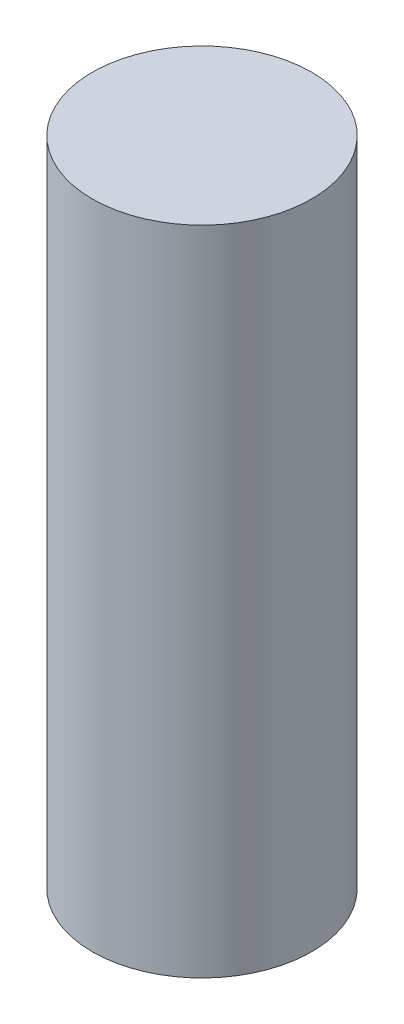
ISO-10303-21;
HEADER;
FILE_DESCRIPTION(('STEP AP214'),'2;1');
FILE_NAME('part.step','',(''),(''),'','','');
FILE_SCHEMA(('AUTOMOTIVE_DESIGN { 1 0 10303 214 1 1 1 1 }'));
ENDSEC;
DATA;
#1=APPLICATION_CONTEXT('core data for automotive mechanical design processes');
#2=APPLICATION_PROTOCOL_DEFINITION('international standard','automotive_design',2000,#1);
#3=PRODUCT_CONTEXT('',#1,'mechanical');
#4=PRODUCT('Part','Part','',(#3));
#5=PRODUCT_RELATED_PRODUCT_CATEGORY('part','',(#4));
#6=PRODUCT_DEFINITION_FORMATION('','',#4);
#7=PRODUCT_DEFINITION_CONTEXT('part definition',#1,'design');
#8=PRODUCT_DEFINITION('design','',#6,#7);
#9=PRODUCT_DEFINITION_SHAPE('','',#8);
#10=(LENGTH_UNIT() NAMED_UNIT(*) SI_UNIT(.MILLI.,.METRE.));
#11=(NAMED_UNIT(*) PLANE_ANGLE_UNIT() SI_UNIT($,.RADIAN.));
#12=(NAMED_UNIT(*) SI_UNIT($,.STERADIAN.) SOLID_ANGLE_UNIT());
#13=UNCERTAINTY_MEASURE_WITH_UNIT(LENGTH_MEASURE(1.E-05),#10,'distance_accuracy_value','');
#14=(GEOMETRIC_REPRESENTATION_CONTEXT(3) GLOBAL_UNCERTAINTY_ASSIGNED_CONTEXT((#13)) GLOBAL_UNIT_ASSIGNED_CONTEXT((#10,
#11,#12)) REPRESENTATION_CONTEXT('',''));
#15=CARTESIAN_POINT('',(0.,0.,0.));
#16=DIRECTION('',(0.,0.,1.));
#17=DIRECTION('',(1.,0.,0.));
#18=AXIS2_PLACEMENT_3D('',#15,#16,#17);
#19=CARTESIAN_POINT('',(0.,7.5,0.));
#20=DIRECTION('',(0.,-1.,0.));
#21=DIRECTION('',(0.,0.,-1.));
#22=AXIS2_PLACEMENT_3D('',#19,#20,#21);
#23=CYLINDRICAL_SURFACE('',#22,2.525);
#24=CARTESIAN_POINT('',(0.,7.5,0.));
#25=DIRECTION('',(0.,1.,0.));
#26=DIRECTION('',(0.,0.,1.));
#27=AXIS2_PLACEMENT_3D('',#24,#25,#26);
#28=CIRCLE('',#27,2.525);
#29=CARTESIAN_POINT('',(0.,7.5,2.525));
#30=VERTEX_POINT('',#29);
#31=EDGE_CURVE('E10',#30,#30,#28,.T.);
#32=ORIENTED_EDGE('',*,*,#31,.F.);
#33=EDGE_LOOP('',(#32));
#34=FACE_BOUND('',#33,.T.);
#35=CARTESIAN_POINT('',(0.,-7.5,0.));
#36=DIRECTION('',(0.,1.,0.));
#37=DIRECTION('',(0.,0.,1.));
#38=AXIS2_PLACEMENT_3D('',#35,#36,#37);
#39=CIRCLE('',#38,2.525);
#40=CARTESIAN_POINT('',(0.,-7.5,2.525));
#41=VERTEX_POINT('',#40);
#42=EDGE_CURVE('E42',#41,#41,#39,.T.);
#43=ORIENTED_EDGE('',*,*,#42,.T.);
#44=EDGE_LOOP('',(#43));
#45=FACE_BOUND('',#44,.T.);
#46=ADVANCED_FACE('F39',(#34,#45),#23,.T.);
#47=CARTESIAN_POINT('',(0.,7.5,0.));
#48=DIRECTION('',(0.,1.,0.));
#49=DIRECTION('',(0.,0.,1.));
#50=AXIS2_PLACEMENT_3D('',#47,#48,#49);
#51=PLANE('',#50);
#52=ORIENTED_EDGE('',*,*,#31,.T.);
#53=EDGE_LOOP('',(#52));
#54=FACE_BOUND('',#53,.T.);
#55=ADVANCED_FACE('F54',(#54),#51,.T.);
#56=CARTESIAN_POINT('',(0.,-7.5,0.));
#57=DIRECTION('',(0.,1.,0.));
#58=DIRECTION('',(0.,0.,1.));
#59=AXIS2_PLACEMENT_3D('',#56,#57,#58);
#60=PLANE('',#59);
#61=ORIENTED_EDGE('',*,*,#42,.F.);
#62=EDGE_LOOP('',(#61));
#63=FACE_BOUND('',#62,.T.);
#64=ADVANCED_FACE('F52',(#63),#60,.F.);
#65=CLOSED_SHELL('',(#46,#55,#64));
#66=MANIFOLD_SOLID_BREP('B2',#65);
#67=ADVANCED_BREP_SHAPE_REPRESENTATION('',(#18,#66),#14);
#68=SHAPE_DEFINITION_REPRESENTATION(#9,#67);
ENDSEC;
END-ISO-10303-21;
